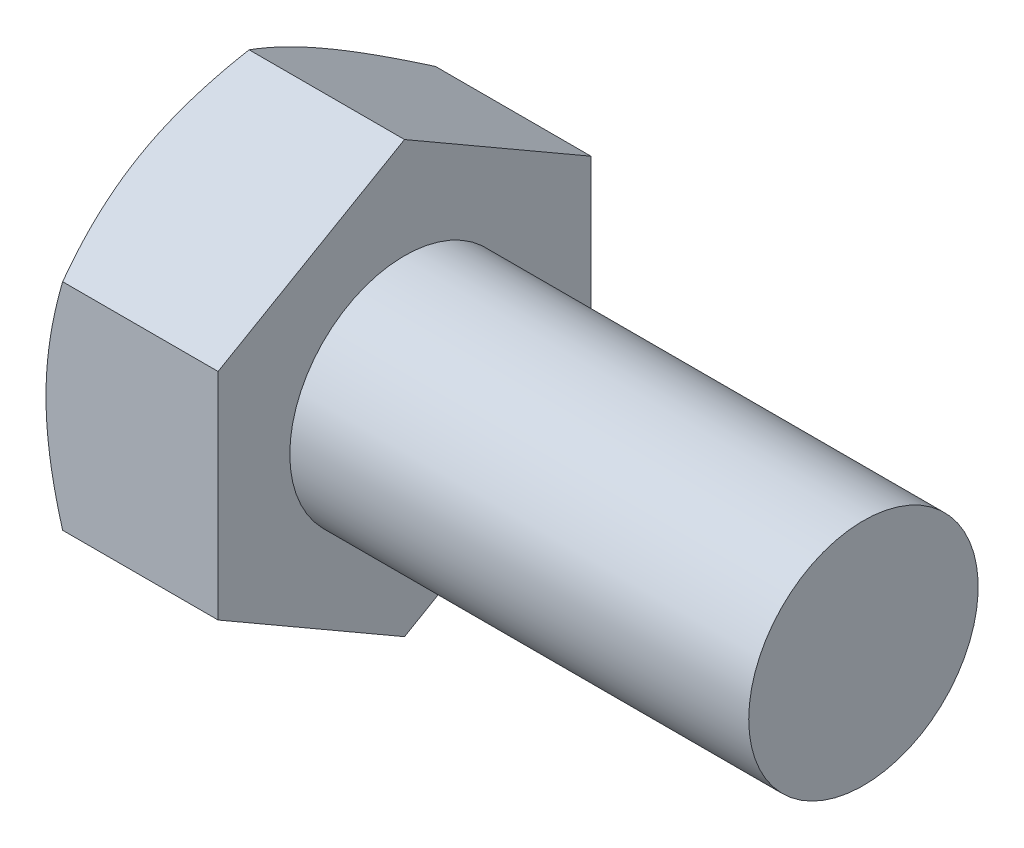
ISO-10303-21;
HEADER;
FILE_DESCRIPTION(('STEP AP214'),'2;1');
FILE_NAME('part.step','',(''),(''),'','','');
FILE_SCHEMA(('AUTOMOTIVE_DESIGN { 1 0 10303 214 1 1 1 1 }'));
ENDSEC;
DATA;
#1=APPLICATION_CONTEXT('core data for automotive mechanical design processes');
#2=APPLICATION_PROTOCOL_DEFINITION('international standard','automotive_design',2000,#1);
#3=PRODUCT_CONTEXT('',#1,'mechanical');
#4=PRODUCT('Part','Part','',(#3));
#5=PRODUCT_RELATED_PRODUCT_CATEGORY('part','',(#4));
#6=PRODUCT_DEFINITION_FORMATION('','',#4);
#7=PRODUCT_DEFINITION_CONTEXT('part definition',#1,'design');
#8=PRODUCT_DEFINITION('design','',#6,#7);
#9=PRODUCT_DEFINITION_SHAPE('','',#8);
#10=(LENGTH_UNIT() NAMED_UNIT(*) SI_UNIT(.MILLI.,.METRE.));
#11=(NAMED_UNIT(*) PLANE_ANGLE_UNIT() SI_UNIT($,.RADIAN.));
#12=(NAMED_UNIT(*) SI_UNIT($,.STERADIAN.) SOLID_ANGLE_UNIT());
#13=UNCERTAINTY_MEASURE_WITH_UNIT(LENGTH_MEASURE(1.E-05),#10,'distance_accuracy_value','');
#14=(GEOMETRIC_REPRESENTATION_CONTEXT(3) GLOBAL_UNCERTAINTY_ASSIGNED_CONTEXT((#13)) GLOBAL_UNIT_ASSIGNED_CONTEXT((#10,
#11,#12)) REPRESENTATION_CONTEXT('',''));
#15=CARTESIAN_POINT('',(0.,0.,0.));
#16=DIRECTION('',(0.,0.,1.));
#17=DIRECTION('',(1.,0.,0.));
#18=AXIS2_PLACEMENT_3D('',#15,#16,#17);
#19=CARTESIAN_POINT('',(6.,4.,0.));
#20=DIRECTION('',(-1.,0.,0.));
#21=DIRECTION('',(0.,0.,1.));
#22=AXIS2_PLACEMENT_3D('',#19,#20,#21);
#23=PLANE('',#22);
#24=CARTESIAN_POINT('',(6.,0.,0.));
#25=DIRECTION('',(-1.,0.,0.));
#26=DIRECTION('',(0.,0.,1.));
#27=AXIS2_PLACEMENT_3D('',#24,#25,#26);
#28=CIRCLE('',#27,4.);
#29=CARTESIAN_POINT('',(6.,0.,4.));
#30=VERTEX_POINT('',#29);
#31=EDGE_CURVE('E202',#30,#30,#28,.T.);
#32=ORIENTED_EDGE('',*,*,#31,.T.);
#33=EDGE_LOOP('',(#32));
#34=FACE_BOUND('',#33,.T.);
#35=DIRECTION('',(0.,1.,0.));
#36=VECTOR('',#35,1.);
#37=CARTESIAN_POINT('',(6.,-3.75277676613162,6.5));
#38=LINE('',#37,#36);
#39=CARTESIAN_POINT('',(6.,-3.75277676613162,6.5));
#40=VERTEX_POINT('',#39);
#41=CARTESIAN_POINT('',(6.,3.75277676613188,6.5));
#42=VERTEX_POINT('',#41);
#43=EDGE_CURVE('E62',#40,#42,#38,.T.);
#44=ORIENTED_EDGE('',*,*,#43,.F.);
#45=DIRECTION('',(0.,0.500000001638715,0.866025402838326));
#46=VECTOR('',#45,1.);
#47=CARTESIAN_POINT('',(6.,-7.50555353226347,0.));
#48=LINE('',#47,#46);
#49=CARTESIAN_POINT('',(6.,-7.50555353226347,0.));
#50=VERTEX_POINT('',#49);
#51=EDGE_CURVE('E135',#50,#40,#48,.T.);
#52=ORIENTED_EDGE('',*,*,#51,.F.);
#53=DIRECTION('',(0.,-0.500000001638715,0.866025402838326));
#54=VECTOR('',#53,1.);
#55=CARTESIAN_POINT('',(6.,-3.75277676613162,-6.5));
#56=LINE('',#55,#54);
#57=CARTESIAN_POINT('',(6.,-3.75277676613162,-6.5));
#58=VERTEX_POINT('',#57);
#59=EDGE_CURVE('E133',#58,#50,#56,.T.);
#60=ORIENTED_EDGE('',*,*,#59,.F.);
#61=DIRECTION('',(0.,-1.,0.));
#62=VECTOR('',#61,1.);
#63=CARTESIAN_POINT('',(6.,3.75277676613188,-6.5));
#64=LINE('',#63,#62);
#65=CARTESIAN_POINT('',(6.,3.75277676613188,-6.5));
#66=VERTEX_POINT('',#65);
#67=EDGE_CURVE('E116',#66,#58,#64,.T.);
#68=ORIENTED_EDGE('',*,*,#67,.F.);
#69=DIRECTION('',(0.,-0.500000001638715,-0.866025402838326));
#70=VECTOR('',#69,1.);
#71=CARTESIAN_POINT('',(6.,7.50555353226373,0.));
#72=LINE('',#71,#70);
#73=CARTESIAN_POINT('',(6.,7.50555353226373,0.));
#74=VERTEX_POINT('',#73);
#75=EDGE_CURVE('E125',#74,#66,#72,.T.);
#76=ORIENTED_EDGE('',*,*,#75,.F.);
#77=DIRECTION('',(0.,0.500000001638715,-0.866025402838326));
#78=VECTOR('',#77,1.);
#79=CARTESIAN_POINT('',(6.,3.75277676613188,6.5));
#80=LINE('',#79,#78);
#81=EDGE_CURVE('E129',#42,#74,#80,.T.);
#82=ORIENTED_EDGE('',*,*,#81,.F.);
#83=EDGE_LOOP('',(#44,#52,#60,#68,#76,#82));
#84=FACE_BOUND('',#83,.T.);
#85=ADVANCED_FACE('F39',(#34,#84),#23,.F.);
#86=CARTESIAN_POINT('',(-25.4,0.,0.));
#87=DIRECTION('',(-1.,0.,0.));
#88=DIRECTION('',(0.,0.,1.));
#89=AXIS2_PLACEMENT_3D('',#86,#87,#88);
#90=CYLINDRICAL_SURFACE('',#89,4.);
#91=CARTESIAN_POINT('',(22.,0.,0.));
#92=DIRECTION('',(-1.,0.,0.));
#93=DIRECTION('',(0.,0.,1.));
#94=AXIS2_PLACEMENT_3D('',#91,#92,#93);
#95=CIRCLE('',#94,4.);
#96=CARTESIAN_POINT('',(22.,0.,4.));
#97=VERTEX_POINT('',#96);
#98=EDGE_CURVE('E11',#97,#97,#95,.T.);
#99=ORIENTED_EDGE('',*,*,#98,.T.);
#100=EDGE_LOOP('',(#99));
#101=FACE_BOUND('',#100,.T.);
#102=ORIENTED_EDGE('',*,*,#31,.F.);
#103=EDGE_LOOP('',(#102));
#104=FACE_BOUND('',#103,.T.);
#105=ADVANCED_FACE('F41',(#101,#104),#90,.T.);
#106=CARTESIAN_POINT('',(22.,4.,0.));
#107=DIRECTION('',(1.,0.,0.));
#108=DIRECTION('',(0.,0.,-1.));
#109=AXIS2_PLACEMENT_3D('',#106,#107,#108);
#110=PLANE('',#109);
#111=ORIENTED_EDGE('',*,*,#98,.F.);
#112=EDGE_LOOP('',(#111));
#113=FACE_BOUND('',#112,.T.);
#114=ADVANCED_FACE('F183',(#113),#110,.T.);
#115=CARTESIAN_POINT('',(6.,-3.75277676613162,6.5));
#116=DIRECTION('',(0.,0.,1.));
#117=DIRECTION('',(1.,0.,0.));
#118=AXIS2_PLACEMENT_3D('',#115,#116,#117);
#119=PLANE('',#118);
#120=DIRECTION('',(-1.,0.,0.));
#121=VECTOR('',#120,1.);
#122=CARTESIAN_POINT('',(6.,-3.75277676613162,6.5));
#123=LINE('',#122,#121);
#124=CARTESIAN_POINT('',(0.580556588334764,-3.75277676613162,6.5));
#125=VERTEX_POINT('',#124);
#126=EDGE_CURVE('E142',#40,#125,#123,.T.);
#127=ORIENTED_EDGE('',*,*,#126,.F.);
#128=ORIENTED_EDGE('',*,*,#43,.T.);
#129=DIRECTION('',(-1.,0.,0.));
#130=VECTOR('',#129,1.);
#131=CARTESIAN_POINT('',(6.,3.75277676613188,6.5));
#132=LINE('',#131,#130);
#133=CARTESIAN_POINT('',(0.580556588334838,3.75277676613188,6.5));
#134=VERTEX_POINT('',#133);
#135=EDGE_CURVE('E141',#42,#134,#132,.T.);
#136=ORIENTED_EDGE('',*,*,#135,.T.);
#137=CARTESIAN_POINT('',(3.11043211457152,-9.95293462980576,6.5));
#138=CARTESIAN_POINT('',(2.97251732999807,-9.66754773691573,6.5));
#139=CARTESIAN_POINT('',(2.83597352767403,-9.38148609518812,6.5));
#140=CARTESIAN_POINT('',(2.56641131225518,-8.80764848282785,6.5));
#141=CARTESIAN_POINT('',(2.43339350953815,-8.51987222580645,6.5));
#142=CARTESIAN_POINT('',(2.17096597683623,-7.94068601624752,6.5));
#143=CARTESIAN_POINT('',(2.04158125030935,-7.64926469367662,6.5));
#144=CARTESIAN_POINT('',(1.78836916374542,-7.06402681165506,6.5));
#145=CARTESIAN_POINT('',(1.66454151402987,-6.77021037800207,6.5));
#146=CARTESIAN_POINT('',(1.42245115301835,-6.17606746350317,6.5));
#147=CARTESIAN_POINT('',(1.3042754278858,-5.87570534433508,6.5));
#148=CARTESIAN_POINT('',(1.07717949532838,-5.27143808598072,6.5));
#149=CARTESIAN_POINT('',(0.968260317643792,-4.96753255687476,6.5));
#150=CARTESIAN_POINT('',(0.762603792727724,-4.35632024518568,6.5));
#151=CARTESIAN_POINT('',(0.665840547140604,-4.04902226498114,6.5));
#152=CARTESIAN_POINT('',(0.487639558111457,-3.43005447940299,6.5));
#153=CARTESIAN_POINT('',(0.406196968217348,-3.11838609017715,6.5));
#154=CARTESIAN_POINT('',(0.262586910330169,-2.4904796310214,6.5));
#155=CARTESIAN_POINT('',(0.200424573648623,-2.17424036798119,6.5));
#156=CARTESIAN_POINT('',(0.0995759642671962,-1.53790476999797,6.5));
#157=CARTESIAN_POINT('',(0.0608897123036656,-1.21780843164827,6.5));
#158=CARTESIAN_POINT('',(0.0229473783649592,-0.737154518749657,6.5));
#159=CARTESIAN_POINT('',(0.0136458496863491,-0.577349337689329,6.5));
#160=CARTESIAN_POINT('',(0.0018143663337142,-0.257481140078587,6.5));
#161=CARTESIAN_POINT('',(-0.000715676279636568,-0.0974181269035752,6.5));
#162=CARTESIAN_POINT('',(0.00106377491840389,0.222623553129355,6.5));
#163=CARTESIAN_POINT('',(0.00537134921124827,0.382602231051633,6.5));
#164=CARTESIAN_POINT('',(0.0207168655482236,0.70223911011887,6.5));
#165=CARTESIAN_POINT('',(0.0317551437048485,0.861897294859796,6.5));
#166=CARTESIAN_POINT('',(0.0664356036466722,1.2488588726394,6.5));
#167=CARTESIAN_POINT('',(0.0934503430170416,1.47586490340125,6.5));
#168=CARTESIAN_POINT('',(0.159587791113402,1.92813751213397,6.5));
#169=CARTESIAN_POINT('',(0.198713804679529,2.15340359810338,6.5));
#170=CARTESIAN_POINT('',(0.287686193091552,2.60201039278955,6.5));
#171=CARTESIAN_POINT('',(0.337542704062787,2.82534907194803,6.5));
#172=CARTESIAN_POINT('',(0.446454887278157,3.26972860257284,6.5));
#173=CARTESIAN_POINT('',(0.505509692919188,3.49076966841465,6.5));
#174=CARTESIAN_POINT('',(0.632949342579862,3.93599818375455,6.5));
#175=CARTESIAN_POINT('',(0.701527403962445,4.16012994530379,6.5));
#176=CARTESIAN_POINT('',(0.845459472946326,4.60602439071538,6.5));
#177=CARTESIAN_POINT('',(0.920808806920055,4.82778859220548,6.5));
#178=CARTESIAN_POINT('',(1.07672700383234,5.26805805858347,6.5));
#179=CARTESIAN_POINT('',(1.15726410060787,5.48657464102612,6.5));
#180=CARTESIAN_POINT('',(1.32306538737706,5.92191241707282,6.5));
#181=CARTESIAN_POINT('',(1.40833148788564,6.13873288448514,6.5));
#182=CARTESIAN_POINT('',(1.49549428820609,6.35476566546691,6.5));
#183=B_SPLINE_CURVE_WITH_KNOTS('',3,(#137,#138,#139,#140,#141,#142,#143,#144,#145,#146,#147,
#148,#149,#150,#151,#152,#153,#154,#155,#156,#157,#158,#159,#160,#161,#162,#163,#164,#165,#166,
#167,#168,#169,#170,#171,#172,#173,#174,#175,#176,#177,#178,#179,#180,#181,#182),.UNSPECIFIED.,
.F.,.F.,(4,2,2,2,2,2,2,2,2,2,2,2,2,2,2,2,2,2,2,2,2,2,4),(0.,0.950904716264929,1.90197298050819,
2.85848379350737,3.81494468759527,4.78314822163398,5.75145932241846,6.71767111714934,
7.68357674987523,8.64973923182811,9.61590256718794,10.0960076379283,10.576106473653,
11.0560705554624,11.5360586072964,12.2215002259562,12.907129048276,13.5934083867621,
14.2796231075672,14.9826585200403,15.6852123608422,16.3838117642958,17.0826954870462),.UNSPECIFIED.);
#184=CARTESIAN_POINT('',(0.,0.,6.5));
#185=VERTEX_POINT('',#184);
#186=EDGE_CURVE('E185',#185,#134,#183,.T.);
#187=ORIENTED_EDGE('',*,*,#186,.F.);
#188=EDGE_CURVE('E193',#125,#185,#183,.T.);
#189=ORIENTED_EDGE('',*,*,#188,.F.);
#190=EDGE_LOOP('',(#127,#128,#136,#187,#189));
#191=FACE_BOUND('',#190,.T.);
#192=ADVANCED_FACE('F179',(#191),#119,.T.);
#193=CARTESIAN_POINT('',(6.,-7.50555353226347,0.));
#194=DIRECTION('',(0.,-0.866025402838326,0.500000001638715));
#195=DIRECTION('',(0.,-0.500000001638715,-0.866025402838326));
#196=AXIS2_PLACEMENT_3D('',#193,#194,#195);
#197=PLANE('',#196);
#198=DIRECTION('',(-1.,0.,0.));
#199=VECTOR('',#198,1.);
#200=CARTESIAN_POINT('',(6.,-7.50555353226347,0.));
#201=LINE('',#200,#199);
#202=CARTESIAN_POINT('',(0.580556602536895,-7.50555353226347,0.));
#203=VERTEX_POINT('',#202);
#204=EDGE_CURVE('E146',#50,#203,#201,.T.);
#205=ORIENTED_EDGE('',*,*,#204,.F.);
#206=ORIENTED_EDGE('',*,*,#51,.T.);
#207=ORIENTED_EDGE('',*,*,#126,.T.);
#208=CARTESIAN_POINT('',(0.580623270742291,-7.50566900231782,-0.000200000000000151));
#209=CARTESIAN_POINT('',(0.53300444166228,-7.42317866226328,0.142677459483736));
#210=CARTESIAN_POINT('',(0.487546718842011,-7.34038075823957,0.286087635386323));
#211=CARTESIAN_POINT('',(0.401548699574276,-7.17411254160279,0.574072633026628));
#212=CARTESIAN_POINT('',(0.361010524438674,-7.09064195535581,0.718647928712168));
#213=CARTESIAN_POINT('',(0.247571017323857,-6.83889372414901,1.15468865397249));
#214=CARTESIAN_POINT('',(0.183047822675304,-6.66962234179951,1.44787528718804));
#215=CARTESIAN_POINT('',(0.107386598181375,-6.41631079686877,1.88662375123456));
#216=CARTESIAN_POINT('',(0.0858328708013411,-6.33302750552641,2.03087464263072));
#217=CARTESIAN_POINT('',(0.0496903283969561,-6.16608460665532,2.32002822417471));
#218=CARTESIAN_POINT('',(0.0351008979865122,-6.08242503303569,2.46493085559026));
#219=CARTESIAN_POINT('',(0.0132587655384416,-5.91496058439091,2.754987787837));
#220=CARTESIAN_POINT('',(0.00599773712137154,-5.83115598288128,2.90014161492544));
#221=CARTESIAN_POINT('',(-0.00103968504414362,-5.66347398888091,3.19057534677937));
#222=CARTESIAN_POINT('',(-0.000816310007988894,-5.57959659871888,3.33585524751142));
#223=CARTESIAN_POINT('',(0.0100834701737812,-5.34979923670106,3.73387595223227));
#224=CARTESIAN_POINT('',(0.0283818290848505,-5.20395448568655,3.98648646990275));
#225=CARTESIAN_POINT('',(0.086406351643979,-4.91323367346418,4.49002968528915));
#226=CARTESIAN_POINT('',(0.126152348138122,-4.76835863469143,4.74096061209552));
#227=CARTESIAN_POINT('',(0.225505911524665,-4.47705273713172,5.24551722500853));
#228=CARTESIAN_POINT('',(0.285534433264515,-4.3306586360546,5.49907924489443));
#229=CARTESIAN_POINT('',(0.421774998706124,-4.04005359573943,6.00242193745634));
#230=CARTESIAN_POINT('',(0.497955039626362,-3.89583893475017,6.25220905639452));
#231=CARTESIAN_POINT('',(0.580623256539505,-3.75266129607728,6.5002));
#232=B_SPLINE_CURVE_WITH_KNOTS('',3,(#208,#209,#210,#211,#212,#213,#214,#215,#216,#217,#218,
#219,#220,#221,#222,#223,#224,#225,#226,#227,#228,#229,#230,#231),.UNSPECIFIED.,.F.,.F.,(4,2,2,
2,2,2,2,2,2,2,2,4),(0.,0.515105054619944,1.03043143952497,2.06322555717465,2.56697390659617,
3.07067773506457,3.57380861916821,4.07692396008232,4.95279356237961,5.82947448150745,
6.72559913491945,7.6199645201219),.UNSPECIFIED.);
#233=CARTESIAN_POINT('',(0.,-5.62916513689814,3.2500000213032));
#234=VERTEX_POINT('',#233);
#235=EDGE_CURVE('E195',#234,#125,#232,.T.);
#236=ORIENTED_EDGE('',*,*,#235,.F.);
#237=EDGE_CURVE('E194',#203,#234,#232,.T.);
#238=ORIENTED_EDGE('',*,*,#237,.F.);
#239=EDGE_LOOP('',(#205,#206,#207,#236,#238));
#240=FACE_BOUND('',#239,.T.);
#241=ADVANCED_FACE('F182',(#240),#197,.T.);
#242=CARTESIAN_POINT('',(6.,-3.75277676613162,-6.5));
#243=DIRECTION('',(0.,-0.866025402838326,-0.500000001638715));
#244=DIRECTION('',(0.,0.500000001638715,-0.866025402838326));
#245=AXIS2_PLACEMENT_3D('',#242,#243,#244);
#246=PLANE('',#245);
#247=DIRECTION('',(-1.,0.,0.));
#248=VECTOR('',#247,1.);
#249=CARTESIAN_POINT('',(6.,-3.75277676613162,-6.5));
#250=LINE('',#249,#248);
#251=CARTESIAN_POINT('',(0.580556588334764,-3.75277676613162,-6.5));
#252=VERTEX_POINT('',#251);
#253=EDGE_CURVE('E122',#58,#252,#250,.T.);
#254=ORIENTED_EDGE('',*,*,#253,.F.);
#255=ORIENTED_EDGE('',*,*,#59,.T.);
#256=ORIENTED_EDGE('',*,*,#204,.T.);
#257=CARTESIAN_POINT('',(0.580623256539505,-3.75266129607728,-6.5002));
#258=CARTESIAN_POINT('',(0.533004428042496,-3.83515163593267,-6.35732254086121));
#259=CARTESIAN_POINT('',(0.487546705819854,-3.91794953975626,-6.21391236530523));
#260=CARTESIAN_POINT('',(0.401548687774503,-4.08421775598865,-5.92592736836536));
#261=CARTESIAN_POINT('',(0.361010513263669,-4.16768834203134,-5.78135207303365));
#262=CARTESIAN_POINT('',(0.247571008067872,-4.41943657260323,-5.34531134887302));
#263=CARTESIAN_POINT('',(0.183047814748901,-4.58870795451258,-5.05212471641982));
#264=CARTESIAN_POINT('',(0.107386592246508,-4.84201949876271,-4.61337625355217));
#265=CARTESIAN_POINT('',(0.0858328655208138,-4.92530278988284,-4.4691253625409));
#266=CARTESIAN_POINT('',(0.0496903244176173,-5.09224568829661,-4.17997178178903));
#267=CARTESIAN_POINT('',(0.0351008946540288,-5.17590526168113,-4.03506915078071));
#268=CARTESIAN_POINT('',(0.0132587634756797,-5.3433697098436,-3.74501221936936));
#269=CARTESIAN_POINT('',(0.00599773568165077,-5.42717431110605,-3.59985839270905));
#270=CARTESIAN_POINT('',(-0.00103968527714462,-5.59485630459847,-3.30942466173491));
#271=CARTESIAN_POINT('',(-0.000816309657297311,-5.67873369449973,-3.16414476145452));
#272=CARTESIAN_POINT('',(0.0100834720961565,-5.90853105676403,-2.76612405630676));
#273=CARTESIAN_POINT('',(0.0283818320924306,-6.05437580827185,-2.51351353778185));
#274=CARTESIAN_POINT('',(0.0864063568768218,-6.34509662144105,-2.00997032075548));
#275=CARTESIAN_POINT('',(0.126152354511249,-6.48997166066727,-1.75903939316367));
#276=CARTESIAN_POINT('',(0.225505920188913,-6.78127755912478,-1.25448277869564));
#277=CARTESIAN_POINT('',(0.285534443080776,-6.92767166064539,-1.00092075804159));
#278=CARTESIAN_POINT('',(0.421775010768129,-7.21827670182222,-0.497578063987229));
#279=CARTESIAN_POINT('',(0.497955052781645,-7.36249136322977,-0.247790944324558));
#280=CARTESIAN_POINT('',(0.58062327074229,-7.50566900231782,0.000199999999999643));
#281=B_SPLINE_CURVE_WITH_KNOTS('',3,(#257,#258,#259,#260,#261,#262,#263,#264,#265,#266,#267,
#268,#269,#270,#271,#272,#273,#274,#275,#276,#277,#278,#279,#280),.UNSPECIFIED.,.F.,.F.,(4,2,2,
2,2,2,2,2,2,2,2,4),(0.,0.515105052986574,1.03043143625733,2.06322555055849,2.56697389840573,
3.07067772530044,3.57380860784243,4.07692394719578,4.95279355264481,5.82947447493455,
6.7255991316514,7.61996452012145),.UNSPECIFIED.);
#282=CARTESIAN_POINT('',(0.,-5.62916513689814,-3.2500000213032));
#283=VERTEX_POINT('',#282);
#284=EDGE_CURVE('E225',#283,#203,#281,.T.);
#285=ORIENTED_EDGE('',*,*,#284,.F.);
#286=EDGE_CURVE('E230',#252,#283,#281,.T.);
#287=ORIENTED_EDGE('',*,*,#286,.F.);
#288=EDGE_LOOP('',(#254,#255,#256,#285,#287));
#289=FACE_BOUND('',#288,.T.);
#290=ADVANCED_FACE('F301',(#289),#246,.T.);
#291=CARTESIAN_POINT('',(6.,3.75277676613188,-6.5));
#292=DIRECTION('',(0.,0.,-1.));
#293=DIRECTION('',(-1.,0.,0.));
#294=AXIS2_PLACEMENT_3D('',#291,#292,#293);
#295=PLANE('',#294);
#296=DIRECTION('',(-1.,0.,0.));
#297=VECTOR('',#296,1.);
#298=CARTESIAN_POINT('',(6.,3.75277676613188,-6.5));
#299=LINE('',#298,#297);
#300=CARTESIAN_POINT('',(0.580556588334838,3.75277676613188,-6.5));
#301=VERTEX_POINT('',#300);
#302=EDGE_CURVE('E111',#66,#301,#299,.T.);
#303=ORIENTED_EDGE('',*,*,#302,.F.);
#304=ORIENTED_EDGE('',*,*,#67,.T.);
#305=ORIENTED_EDGE('',*,*,#253,.T.);
#306=CARTESIAN_POINT('',(3.11043211457152,-9.95293462980576,-6.5));
#307=CARTESIAN_POINT('',(2.97251732999807,-9.66754773691573,-6.5));
#308=CARTESIAN_POINT('',(2.83597352767403,-9.38148609518812,-6.5));
#309=CARTESIAN_POINT('',(2.56641131225518,-8.80764848282785,-6.5));
#310=CARTESIAN_POINT('',(2.43339350953815,-8.51987222580645,-6.5));
#311=CARTESIAN_POINT('',(2.17096597683623,-7.94068601624752,-6.5));
#312=CARTESIAN_POINT('',(2.04158125030935,-7.64926469367662,-6.5));
#313=CARTESIAN_POINT('',(1.78836916374542,-7.06402681165506,-6.5));
#314=CARTESIAN_POINT('',(1.66454151402987,-6.77021037800207,-6.5));
#315=CARTESIAN_POINT('',(1.42245115301835,-6.17606746350317,-6.5));
#316=CARTESIAN_POINT('',(1.3042754278858,-5.87570534433508,-6.5));
#317=CARTESIAN_POINT('',(1.07717949532838,-5.27143808598072,-6.5));
#318=CARTESIAN_POINT('',(0.968260317643792,-4.96753255687476,-6.5));
#319=CARTESIAN_POINT('',(0.762603792727724,-4.35632024518568,-6.5));
#320=CARTESIAN_POINT('',(0.665840547140604,-4.04902226498114,-6.5));
#321=CARTESIAN_POINT('',(0.487639558111457,-3.43005447940299,-6.5));
#322=CARTESIAN_POINT('',(0.406196968217348,-3.11838609017715,-6.5));
#323=CARTESIAN_POINT('',(0.262586910330169,-2.4904796310214,-6.5));
#324=CARTESIAN_POINT('',(0.200424573648623,-2.17424036798119,-6.5));
#325=CARTESIAN_POINT('',(0.0995759642671962,-1.53790476999797,-6.5));
#326=CARTESIAN_POINT('',(0.0608897123036656,-1.21780843164827,-6.5));
#327=CARTESIAN_POINT('',(0.0229473783649592,-0.737154518749657,-6.5));
#328=CARTESIAN_POINT('',(0.0136458496863491,-0.577349337689329,-6.5));
#329=CARTESIAN_POINT('',(0.0018143663337142,-0.257481140078587,-6.5));
#330=CARTESIAN_POINT('',(-0.000715676279636568,-0.0974181269035752,-6.5));
#331=CARTESIAN_POINT('',(0.00106377491840389,0.222623553129355,-6.5));
#332=CARTESIAN_POINT('',(0.00537134921124827,0.382602231051633,-6.5));
#333=CARTESIAN_POINT('',(0.0207168655482236,0.70223911011887,-6.5));
#334=CARTESIAN_POINT('',(0.0317551437048485,0.861897294859796,-6.5));
#335=CARTESIAN_POINT('',(0.0664356036466722,1.2488588726394,-6.5));
#336=CARTESIAN_POINT('',(0.0934503430170416,1.47586490340125,-6.5));
#337=CARTESIAN_POINT('',(0.159587791113402,1.92813751213397,-6.5));
#338=CARTESIAN_POINT('',(0.198713804679529,2.15340359810338,-6.5));
#339=CARTESIAN_POINT('',(0.287686193091552,2.60201039278955,-6.5));
#340=CARTESIAN_POINT('',(0.337542704062787,2.82534907194803,-6.5));
#341=CARTESIAN_POINT('',(0.446454887278157,3.26972860257284,-6.5));
#342=CARTESIAN_POINT('',(0.505509692919188,3.49076966841465,-6.5));
#343=CARTESIAN_POINT('',(0.632949342579862,3.93599818375455,-6.5));
#344=CARTESIAN_POINT('',(0.701527403962445,4.16012994530379,-6.5));
#345=CARTESIAN_POINT('',(0.845459472946326,4.60602439071538,-6.5));
#346=CARTESIAN_POINT('',(0.920808806920055,4.82778859220548,-6.5));
#347=CARTESIAN_POINT('',(1.07672700383234,5.26805805858347,-6.5));
#348=CARTESIAN_POINT('',(1.15726410060787,5.48657464102612,-6.5));
#349=CARTESIAN_POINT('',(1.32306538737706,5.92191241707282,-6.5));
#350=CARTESIAN_POINT('',(1.40833148788564,6.13873288448514,-6.5));
#351=CARTESIAN_POINT('',(1.49549428820609,6.35476566546691,-6.5));
#352=B_SPLINE_CURVE_WITH_KNOTS('',3,(#306,#307,#308,#309,#310,#311,#312,#313,#314,#315,#316,
#317,#318,#319,#320,#321,#322,#323,#324,#325,#326,#327,#328,#329,#330,#331,#332,#333,#334,#335,
#336,#337,#338,#339,#340,#341,#342,#343,#344,#345,#346,#347,#348,#349,#350,#351),.UNSPECIFIED.,
.F.,.F.,(4,2,2,2,2,2,2,2,2,2,2,2,2,2,2,2,2,2,2,2,2,2,4),(0.,0.950904716264929,1.90197298050819,
2.85848379350737,3.81494468759527,4.78314822163398,5.75145932241846,6.71767111714934,
7.68357674987523,8.64973923182811,9.61590256718794,10.0960076379283,10.576106473653,
11.0560705554624,11.5360586072964,12.2215002259562,12.907129048276,13.5934083867621,
14.2796231075672,14.9826585200403,15.6852123608422,16.3838117642958,17.0826954870462),.UNSPECIFIED.);
#353=CARTESIAN_POINT('',(0.,0.,-6.5));
#354=VERTEX_POINT('',#353);
#355=EDGE_CURVE('E226',#354,#252,#352,.F.);
#356=ORIENTED_EDGE('',*,*,#355,.F.);
#357=EDGE_CURVE('E119',#301,#354,#352,.F.);
#358=ORIENTED_EDGE('',*,*,#357,.F.);
#359=EDGE_LOOP('',(#303,#304,#305,#356,#358));
#360=FACE_BOUND('',#359,.T.);
#361=ADVANCED_FACE('F113',(#360),#295,.T.);
#362=CARTESIAN_POINT('',(6.,7.50555353226373,0.));
#363=DIRECTION('',(0.,0.866025402838326,-0.500000001638715));
#364=DIRECTION('',(0.,0.500000001638715,0.866025402838326));
#365=AXIS2_PLACEMENT_3D('',#362,#363,#364);
#366=PLANE('',#365);
#367=DIRECTION('',(-1.,0.,0.));
#368=VECTOR('',#367,1.);
#369=CARTESIAN_POINT('',(6.,7.50555353226373,0.));
#370=LINE('',#369,#368);
#371=CARTESIAN_POINT('',(0.580556602537043,7.50555353226373,0.));
#372=VERTEX_POINT('',#371);
#373=EDGE_CURVE('E54',#74,#372,#370,.T.);
#374=ORIENTED_EDGE('',*,*,#373,.F.);
#375=ORIENTED_EDGE('',*,*,#75,.T.);
#376=ORIENTED_EDGE('',*,*,#302,.T.);
#377=CARTESIAN_POINT('',(0.580623270742439,7.50566900231807,0.000200000000000122));
#378=CARTESIAN_POINT('',(0.533004441662426,7.42317866226353,-0.14267745948374));
#379=CARTESIAN_POINT('',(0.487546718842156,7.34038075823982,-0.286087635386333));
#380=CARTESIAN_POINT('',(0.401548699574418,7.17411254160303,-0.574072633026647));
#381=CARTESIAN_POINT('',(0.361010524438815,7.09064195535606,-0.718647928712191));
#382=CARTESIAN_POINT('',(0.247571017323994,6.83889372414925,-1.15468865397252));
#383=CARTESIAN_POINT('',(0.183047822675439,6.66962234179974,-1.44787528718809));
#384=CARTESIAN_POINT('',(0.107386598181507,6.41631079686899,-1.88662375123462));
#385=CARTESIAN_POINT('',(0.0858328708014726,6.33302750552663,-2.03087464263079));
#386=CARTESIAN_POINT('',(0.0496903283970863,6.16608460665553,-2.32002822417479));
#387=CARTESIAN_POINT('',(0.0351008979866418,6.08242503303589,-2.46493085559034));
#388=CARTESIAN_POINT('',(0.0132587655385701,5.91496058439111,-2.75498778783709));
#389=CARTESIAN_POINT('',(0.00599773712149967,5.83115598288148,-2.90014161492553));
#390=CARTESIAN_POINT('',(-0.00103968504401586,5.6634739888811,-3.19057534677948));
#391=CARTESIAN_POINT('',(-0.000816310007861087,5.57959659871907,-3.33585524751154));
#392=CARTESIAN_POINT('',(0.0100834701739089,5.34979923670125,-3.73387595223238));
#393=CARTESIAN_POINT('',(0.0283818290849765,5.20395448568675,-3.98648646990284));
#394=CARTESIAN_POINT('',(0.0864063516440993,4.91323367346439,-4.49002968528923));
#395=CARTESIAN_POINT('',(0.126152348138238,4.76835863469165,-4.74096061209558));
#396=CARTESIAN_POINT('',(0.225505911524771,4.47705273713195,-5.24551722500857));
#397=CARTESIAN_POINT('',(0.285534433264616,4.33065863605483,-5.49907924489447));
#398=CARTESIAN_POINT('',(0.421774998706212,4.04005359573967,-6.00242193745636));
#399=CARTESIAN_POINT('',(0.497955039626443,3.89583893475042,-6.25220905639453));
#400=CARTESIAN_POINT('',(0.580623256539578,3.75266129607754,-6.5002));
#401=B_SPLINE_CURVE_WITH_KNOTS('',3,(#377,#378,#379,#380,#381,#382,#383,#384,#385,#386,#387,
#388,#389,#390,#391,#392,#393,#394,#395,#396,#397,#398,#399,#400),.UNSPECIFIED.,.F.,.F.,(4,2,2,
2,2,2,2,2,2,2,2,4),(0.,0.515105054619961,1.030431439525,2.06322555717471,2.56697390659626,
3.07067773506467,3.57380861916833,4.07692396008246,4.95279356237971,5.82947448150752,
6.72559913491948,7.6199645201219),.UNSPECIFIED.);
#402=CARTESIAN_POINT('',(0.,5.62916513689833,-3.25000002130331));
#403=VERTEX_POINT('',#402);
#404=EDGE_CURVE('E161',#403,#301,#401,.T.);
#405=ORIENTED_EDGE('',*,*,#404,.F.);
#406=EDGE_CURVE('E289',#372,#403,#401,.T.);
#407=ORIENTED_EDGE('',*,*,#406,.F.);
#408=EDGE_LOOP('',(#374,#375,#376,#405,#407));
#409=FACE_BOUND('',#408,.T.);
#410=ADVANCED_FACE('F126',(#409),#366,.T.);
#411=CARTESIAN_POINT('',(6.,3.75277676613188,6.5));
#412=DIRECTION('',(0.,0.866025402838326,0.500000001638715));
#413=DIRECTION('',(0.,-0.500000001638715,0.866025402838326));
#414=AXIS2_PLACEMENT_3D('',#411,#412,#413);
#415=PLANE('',#414);
#416=ORIENTED_EDGE('',*,*,#135,.F.);
#417=ORIENTED_EDGE('',*,*,#81,.T.);
#418=ORIENTED_EDGE('',*,*,#373,.T.);
#419=CARTESIAN_POINT('',(0.580623256539578,3.75266129607754,6.5002));
#420=CARTESIAN_POINT('',(0.533004428042572,3.83515163593292,6.35732254086121));
#421=CARTESIAN_POINT('',(0.487546705819931,3.91794953975652,6.21391236530522));
#422=CARTESIAN_POINT('',(0.401548687774584,4.08421775598891,5.92592736836535));
#423=CARTESIAN_POINT('',(0.361010513263751,4.1676883420316,5.78135207303364));
#424=CARTESIAN_POINT('',(0.24757100806796,4.4194365726035,5.345311348873));
#425=CARTESIAN_POINT('',(0.183047814748994,4.58870795451286,5.0521247164198));
#426=CARTESIAN_POINT('',(0.107386592246608,4.84201949876299,4.61337625355213));
#427=CARTESIAN_POINT('',(0.0858328655209173,4.92530278988313,4.46912536254086));
#428=CARTESIAN_POINT('',(0.0496903244177266,5.09224568829689,4.17997178178899));
#429=CARTESIAN_POINT('',(0.0351008946541412,5.17590526168142,4.03506915078066));
#430=CARTESIAN_POINT('',(0.0132587634757979,5.34336970984389,3.7450122193693));
#431=CARTESIAN_POINT('',(0.00599773568177177,5.42717431110634,3.59985839270899));
#432=CARTESIAN_POINT('',(-0.00103968527701775,5.59485630459876,3.30942466173485));
#433=CARTESIAN_POINT('',(-0.000816309657167382,5.67873369450003,3.16414476145445));
#434=CARTESIAN_POINT('',(0.0100834720962944,5.90853105676432,2.76612405630669));
#435=CARTESIAN_POINT('',(0.0283818320925725,6.05437580827214,2.51351353778179));
#436=CARTESIAN_POINT('',(0.0864063568769699,6.34509662144133,2.00997032075544));
#437=CARTESIAN_POINT('',(0.1261523545114,6.48997166066756,1.75903939316363));
#438=CARTESIAN_POINT('',(0.225505920189066,6.78127755912505,1.25448277869561));
#439=CARTESIAN_POINT('',(0.28553444308093,6.92767166064566,1.00092075804157));
#440=CARTESIAN_POINT('',(0.421775010768281,7.21827670182248,0.497578063987218));
#441=CARTESIAN_POINT('',(0.497955052781796,7.36249136323003,0.247790944324552));
#442=CARTESIAN_POINT('',(0.580623270742439,7.50566900231807,-0.000199999999999259));
#443=B_SPLINE_CURVE_WITH_KNOTS('',3,(#419,#420,#421,#422,#423,#424,#425,#426,#427,#428,#429,
#430,#431,#432,#433,#434,#435,#436,#437,#438,#439,#440,#441,#442),.UNSPECIFIED.,.F.,.F.,(4,2,2,
2,2,2,2,2,2,2,2,4),(0.,0.515105052986583,1.03043143625735,2.06322555055852,2.56697389840578,
3.07067772530049,3.57380860784249,4.07692394719585,4.95279355264486,5.82947447493459,
6.72559913165142,7.61996452012145),.UNSPECIFIED.);
#444=CARTESIAN_POINT('',(0.,5.62916513689833,3.25000002130331));
#445=VERTEX_POINT('',#444);
#446=EDGE_CURVE('E145',#445,#372,#443,.T.);
#447=ORIENTED_EDGE('',*,*,#446,.F.);
#448=EDGE_CURVE('E160',#134,#445,#443,.T.);
#449=ORIENTED_EDGE('',*,*,#448,.F.);
#450=EDGE_LOOP('',(#416,#417,#418,#447,#449));
#451=FACE_BOUND('',#450,.T.);
#452=ADVANCED_FACE('F172',(#451),#415,.T.);
#453=CARTESIAN_POINT('',(0.,0.,0.));
#454=DIRECTION('',(1.,0.,0.));
#455=DIRECTION('',(0.,0.,-1.));
#456=AXIS2_PLACEMENT_3D('',#453,#454,#455);
#457=CONICAL_SURFACE('',#456,6.5,1.0471975511966);
#458=CARTESIAN_POINT('',(0.,0.,0.));
#459=DIRECTION('',(-1.,0.,0.));
#460=DIRECTION('',(0.,0.,1.));
#461=AXIS2_PLACEMENT_3D('',#458,#459,#460);
#462=CIRCLE('',#461,6.5);
#463=EDGE_CURVE('E204',#234,#185,#462,.T.);
#464=ORIENTED_EDGE('',*,*,#463,.F.);
#465=ORIENTED_EDGE('',*,*,#235,.T.);
#466=ORIENTED_EDGE('',*,*,#188,.T.);
#467=EDGE_LOOP('',(#464,#465,#466));
#468=FACE_BOUND('',#467,.T.);
#469=ADVANCED_FACE('F176',(#468),#457,.T.);
#470=EDGE_CURVE('E212',#283,#234,#462,.T.);
#471=ORIENTED_EDGE('',*,*,#470,.F.);
#472=ORIENTED_EDGE('',*,*,#284,.T.);
#473=ORIENTED_EDGE('',*,*,#237,.T.);
#474=EDGE_LOOP('',(#471,#472,#473));
#475=FACE_BOUND('',#474,.T.);
#476=ADVANCED_FACE('F235',(#475),#457,.T.);
#477=ORIENTED_EDGE('',*,*,#355,.T.);
#478=ORIENTED_EDGE('',*,*,#286,.T.);
#479=EDGE_CURVE('E215',#354,#283,#462,.T.);
#480=ORIENTED_EDGE('',*,*,#479,.F.);
#481=EDGE_LOOP('',(#477,#478,#480));
#482=FACE_BOUND('',#481,.T.);
#483=ADVANCED_FACE('F168',(#482),#457,.T.);
#484=ORIENTED_EDGE('',*,*,#404,.T.);
#485=ORIENTED_EDGE('',*,*,#357,.T.);
#486=EDGE_CURVE('E211',#403,#354,#462,.T.);
#487=ORIENTED_EDGE('',*,*,#486,.F.);
#488=EDGE_LOOP('',(#484,#485,#487));
#489=FACE_BOUND('',#488,.T.);
#490=ADVANCED_FACE('F224',(#489),#457,.T.);
#491=EDGE_CURVE('E47',#185,#445,#462,.T.);
#492=ORIENTED_EDGE('',*,*,#491,.F.);
#493=ORIENTED_EDGE('',*,*,#186,.T.);
#494=ORIENTED_EDGE('',*,*,#448,.T.);
#495=EDGE_LOOP('',(#492,#493,#494));
#496=FACE_BOUND('',#495,.T.);
#497=ADVANCED_FACE('F264',(#496),#457,.T.);
#498=CARTESIAN_POINT('',(0.,0.,0.));
#499=DIRECTION('',(-1.,0.,0.));
#500=DIRECTION('',(0.,0.,1.));
#501=AXIS2_PLACEMENT_3D('',#498,#499,#500);
#502=PLANE('',#501);
#503=CARTESIAN_POINT('',(0.,0.,0.));
#504=DIRECTION('',(1.,0.,0.));
#505=DIRECTION('',(0.,0.,-1.));
#506=AXIS2_PLACEMENT_3D('',#503,#504,#505);
#507=CIRCLE('',#506,5.6875);
#508=CARTESIAN_POINT('',(0.,0.,-5.6875));
#509=VERTEX_POINT('',#508);
#510=EDGE_CURVE('E243',#509,#509,#507,.T.);
#511=ORIENTED_EDGE('',*,*,#510,.T.);
#512=EDGE_LOOP('',(#511));
#513=FACE_BOUND('',#512,.T.);
#514=ORIENTED_EDGE('',*,*,#491,.T.);
#515=EDGE_CURVE('E206',#445,#403,#462,.T.);
#516=ORIENTED_EDGE('',*,*,#515,.T.);
#517=ORIENTED_EDGE('',*,*,#486,.T.);
#518=ORIENTED_EDGE('',*,*,#479,.T.);
#519=ORIENTED_EDGE('',*,*,#470,.T.);
#520=ORIENTED_EDGE('',*,*,#463,.T.);
#521=EDGE_LOOP('',(#514,#516,#517,#518,#519,#520));
#522=FACE_BOUND('',#521,.T.);
#523=ADVANCED_FACE('F221',(#513,#522),#502,.T.);
#524=ORIENTED_EDGE('',*,*,#446,.T.);
#525=ORIENTED_EDGE('',*,*,#406,.T.);
#526=ORIENTED_EDGE('',*,*,#515,.F.);
#527=EDGE_LOOP('',(#524,#525,#526));
#528=FACE_BOUND('',#527,.T.);
#529=ADVANCED_FACE('F253',(#528),#457,.T.);
#530=CARTESIAN_POINT('',(0.75,0.,0.));
#531=DIRECTION('',(-1.,0.,0.));
#532=DIRECTION('',(0.,0.,1.));
#533=AXIS2_PLACEMENT_3D('',#530,#531,#532);
#534=CYLINDRICAL_SURFACE('',#533,5.6875);
#535=CARTESIAN_POINT('',(0.75,0.,0.));
#536=DIRECTION('',(1.,0.,0.));
#537=DIRECTION('',(0.,0.,-1.));
#538=AXIS2_PLACEMENT_3D('',#535,#536,#537);
#539=CIRCLE('',#538,5.6875);
#540=CARTESIAN_POINT('',(0.75,0.,-5.6875));
#541=VERTEX_POINT('',#540);
#542=EDGE_CURVE('E240',#541,#541,#539,.T.);
#543=ORIENTED_EDGE('',*,*,#542,.T.);
#544=EDGE_LOOP('',(#543));
#545=FACE_BOUND('',#544,.T.);
#546=ORIENTED_EDGE('',*,*,#510,.F.);
#547=EDGE_LOOP('',(#546));
#548=FACE_BOUND('',#547,.T.);
#549=ADVANCED_FACE('F250',(#545,#548),#534,.F.);
#550=CARTESIAN_POINT('',(0.75,0.,0.));
#551=DIRECTION('',(1.,0.,0.));
#552=DIRECTION('',(0.,0.,-1.));
#553=AXIS2_PLACEMENT_3D('',#550,#551,#552);
#554=PLANE('',#553);
#555=ORIENTED_EDGE('',*,*,#542,.F.);
#556=EDGE_LOOP('',(#555));
#557=FACE_BOUND('',#556,.T.);
#558=ADVANCED_FACE('F252',(#557),#554,.F.);
#559=CLOSED_SHELL('',(#85,#105,#114,#192,#241,#290,#361,#410,#452,#469,#476,#483,#490,#497,#523,
#529,#549,#558));
#560=MANIFOLD_SOLID_BREP('B2',#559);
#561=ADVANCED_BREP_SHAPE_REPRESENTATION('',(#18,#560),#14);
#562=SHAPE_DEFINITION_REPRESENTATION(#9,#561);
ENDSEC;
END-ISO-10303-21;
